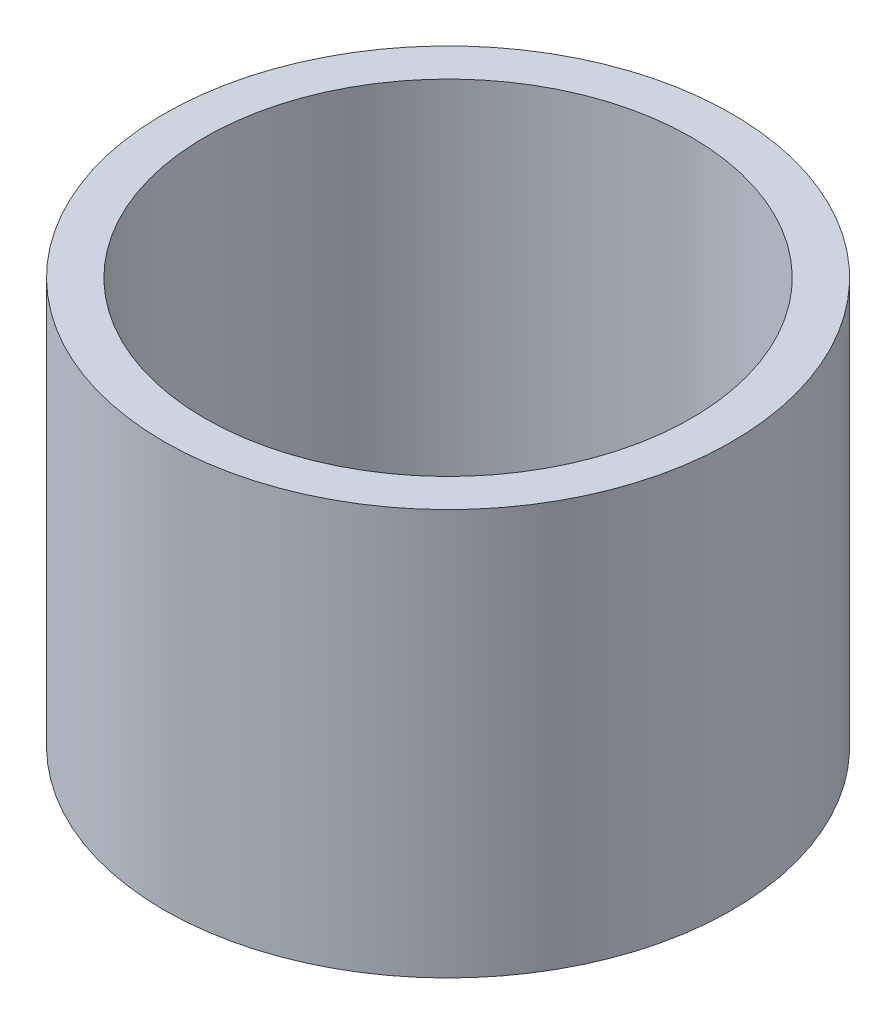
ISO-10303-21;
HEADER;
FILE_DESCRIPTION(('STEP AP214'),'2;1');
FILE_NAME('part.step','',(''),(''),'','','');
FILE_SCHEMA(('AUTOMOTIVE_DESIGN { 1 0 10303 214 1 1 1 1 }'));
ENDSEC;
DATA;
#1=APPLICATION_CONTEXT('core data for automotive mechanical design processes');
#2=APPLICATION_PROTOCOL_DEFINITION('international standard','automotive_design',2000,#1);
#3=PRODUCT_CONTEXT('',#1,'mechanical');
#4=PRODUCT('Part','Part','',(#3));
#5=PRODUCT_RELATED_PRODUCT_CATEGORY('part','',(#4));
#6=PRODUCT_DEFINITION_FORMATION('','',#4);
#7=PRODUCT_DEFINITION_CONTEXT('part definition',#1,'design');
#8=PRODUCT_DEFINITION('design','',#6,#7);
#9=PRODUCT_DEFINITION_SHAPE('','',#8);
#10=(LENGTH_UNIT() NAMED_UNIT(*) SI_UNIT(.MILLI.,.METRE.));
#11=(NAMED_UNIT(*) PLANE_ANGLE_UNIT() SI_UNIT($,.RADIAN.));
#12=(NAMED_UNIT(*) SI_UNIT($,.STERADIAN.) SOLID_ANGLE_UNIT());
#13=UNCERTAINTY_MEASURE_WITH_UNIT(LENGTH_MEASURE(1.E-05),#10,'distance_accuracy_value','');
#14=(GEOMETRIC_REPRESENTATION_CONTEXT(3) GLOBAL_UNCERTAINTY_ASSIGNED_CONTEXT((#13)) GLOBAL_UNIT_ASSIGNED_CONTEXT((#10,
#11,#12)) REPRESENTATION_CONTEXT('',''));
#15=CARTESIAN_POINT('',(0.,0.,0.));
#16=DIRECTION('',(0.,0.,1.));
#17=DIRECTION('',(1.,0.,0.));
#18=AXIS2_PLACEMENT_3D('',#15,#16,#17);
#19=CARTESIAN_POINT('',(0.,10.,0.));
#20=DIRECTION('',(0.,1.,0.));
#21=DIRECTION('',(0.,0.,1.));
#22=AXIS2_PLACEMENT_3D('',#19,#20,#21);
#23=PLANE('',#22);
#24=CARTESIAN_POINT('',(0.,10.,0.));
#25=DIRECTION('',(0.,1.,0.));
#26=DIRECTION('',(0.,0.,1.));
#27=AXIS2_PLACEMENT_3D('',#24,#25,#26);
#28=CIRCLE('',#27,7.);
#29=CARTESIAN_POINT('',(0.,10.,7.));
#30=VERTEX_POINT('',#29);
#31=EDGE_CURVE('E10',#30,#30,#28,.T.);
#32=ORIENTED_EDGE('',*,*,#31,.T.);
#33=EDGE_LOOP('',(#32));
#34=FACE_BOUND('',#33,.T.);
#35=CARTESIAN_POINT('',(0.,10.,0.));
#36=DIRECTION('',(0.,1.,0.));
#37=DIRECTION('',(0.,0.,1.));
#38=AXIS2_PLACEMENT_3D('',#35,#36,#37);
#39=CIRCLE('',#38,6.);
#40=CARTESIAN_POINT('',(0.,10.,6.));
#41=VERTEX_POINT('',#40);
#42=EDGE_CURVE('E56',#41,#41,#39,.T.);
#43=ORIENTED_EDGE('',*,*,#42,.F.);
#44=EDGE_LOOP('',(#43));
#45=FACE_BOUND('',#44,.T.);
#46=ADVANCED_FACE('F43',(#34,#45),#23,.T.);
#47=CARTESIAN_POINT('',(0.,0.,0.));
#48=DIRECTION('',(0.,1.,0.));
#49=DIRECTION('',(0.,0.,1.));
#50=AXIS2_PLACEMENT_3D('',#47,#48,#49);
#51=PLANE('',#50);
#52=CARTESIAN_POINT('',(0.,0.,0.));
#53=DIRECTION('',(0.,1.,0.));
#54=DIRECTION('',(0.,0.,1.));
#55=AXIS2_PLACEMENT_3D('',#52,#53,#54);
#56=CIRCLE('',#55,7.);
#57=CARTESIAN_POINT('',(0.,0.,7.));
#58=VERTEX_POINT('',#57);
#59=EDGE_CURVE('E47',#58,#58,#56,.T.);
#60=ORIENTED_EDGE('',*,*,#59,.F.);
#61=EDGE_LOOP('',(#60));
#62=FACE_BOUND('',#61,.T.);
#63=CARTESIAN_POINT('',(0.,0.,0.));
#64=DIRECTION('',(0.,1.,0.));
#65=DIRECTION('',(0.,0.,1.));
#66=AXIS2_PLACEMENT_3D('',#63,#64,#65);
#67=CIRCLE('',#66,6.);
#68=CARTESIAN_POINT('',(0.,0.,6.));
#69=VERTEX_POINT('',#68);
#70=EDGE_CURVE('E58',#69,#69,#67,.T.);
#71=ORIENTED_EDGE('',*,*,#70,.T.);
#72=EDGE_LOOP('',(#71));
#73=FACE_BOUND('',#72,.T.);
#74=ADVANCED_FACE('F70',(#62,#73),#51,.F.);
#75=CARTESIAN_POINT('',(0.,10.,0.));
#76=DIRECTION('',(0.,-1.,0.));
#77=DIRECTION('',(0.,0.,-1.));
#78=AXIS2_PLACEMENT_3D('',#75,#76,#77);
#79=CYLINDRICAL_SURFACE('',#78,7.);
#80=ORIENTED_EDGE('',*,*,#31,.F.);
#81=EDGE_LOOP('',(#80));
#82=FACE_BOUND('',#81,.T.);
#83=ORIENTED_EDGE('',*,*,#59,.T.);
#84=EDGE_LOOP('',(#83));
#85=FACE_BOUND('',#84,.T.);
#86=ADVANCED_FACE('F45',(#82,#85),#79,.T.);
#87=CARTESIAN_POINT('',(0.,10.,0.));
#88=DIRECTION('',(0.,-1.,0.));
#89=DIRECTION('',(0.,0.,-1.));
#90=AXIS2_PLACEMENT_3D('',#87,#88,#89);
#91=CYLINDRICAL_SURFACE('',#90,6.);
#92=ORIENTED_EDGE('',*,*,#42,.T.);
#93=EDGE_LOOP('',(#92));
#94=FACE_BOUND('',#93,.T.);
#95=ORIENTED_EDGE('',*,*,#70,.F.);
#96=EDGE_LOOP('',(#95));
#97=FACE_BOUND('',#96,.T.);
#98=ADVANCED_FACE('F66',(#94,#97),#91,.F.);
#99=CLOSED_SHELL('',(#46,#74,#86,#98));
#100=MANIFOLD_SOLID_BREP('B2',#99);
#101=ADVANCED_BREP_SHAPE_REPRESENTATION('',(#18,#100),#14);
#102=SHAPE_DEFINITION_REPRESENTATION(#9,#101);
ENDSEC;
END-ISO-10303-21;
